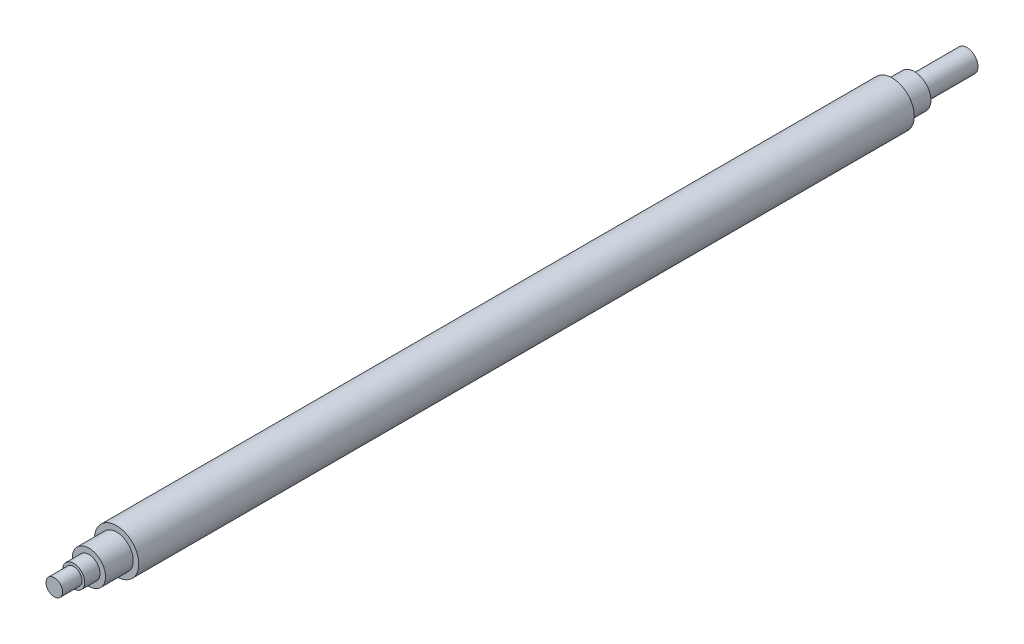
ISO-10303-21;
HEADER;
FILE_DESCRIPTION(('STEP AP214'),'2;1');
FILE_NAME('part.step','',(''),(''),'','','');
FILE_SCHEMA(('AUTOMOTIVE_DESIGN { 1 0 10303 214 1 1 1 1 }'));
ENDSEC;
DATA;
#1=APPLICATION_CONTEXT('core data for automotive mechanical design processes');
#2=APPLICATION_PROTOCOL_DEFINITION('international standard','automotive_design',2000,#1);
#3=PRODUCT_CONTEXT('',#1,'mechanical');
#4=PRODUCT('Part','Part','',(#3));
#5=PRODUCT_RELATED_PRODUCT_CATEGORY('part','',(#4));
#6=PRODUCT_DEFINITION_FORMATION('','',#4);
#7=PRODUCT_DEFINITION_CONTEXT('part definition',#1,'design');
#8=PRODUCT_DEFINITION('design','',#6,#7);
#9=PRODUCT_DEFINITION_SHAPE('','',#8);
#10=(LENGTH_UNIT() NAMED_UNIT(*) SI_UNIT(.MILLI.,.METRE.));
#11=(NAMED_UNIT(*) PLANE_ANGLE_UNIT() SI_UNIT($,.RADIAN.));
#12=(NAMED_UNIT(*) SI_UNIT($,.STERADIAN.) SOLID_ANGLE_UNIT());
#13=UNCERTAINTY_MEASURE_WITH_UNIT(LENGTH_MEASURE(1.E-05),#10,'distance_accuracy_value','');
#14=(GEOMETRIC_REPRESENTATION_CONTEXT(3) GLOBAL_UNCERTAINTY_ASSIGNED_CONTEXT((#13)) GLOBAL_UNIT_ASSIGNED_CONTEXT((#10,
#11,#12)) REPRESENTATION_CONTEXT('',''));
#15=CARTESIAN_POINT('',(0.,0.,0.));
#16=DIRECTION('',(0.,0.,1.));
#17=DIRECTION('',(1.,0.,0.));
#18=AXIS2_PLACEMENT_3D('',#15,#16,#17);
#19=CARTESIAN_POINT('',(0.,0.,-331.));
#20=DIRECTION('',(0.,0.,1.));
#21=DIRECTION('',(1.,0.,0.));
#22=AXIS2_PLACEMENT_3D('',#19,#20,#21);
#23=PLANE('',#22);
#24=CARTESIAN_POINT('',(0.,0.,-331.));
#25=DIRECTION('',(0.,0.,1.));
#26=DIRECTION('',(1.,0.,0.));
#27=AXIS2_PLACEMENT_3D('',#24,#25,#26);
#28=CIRCLE('',#27,4.);
#29=CARTESIAN_POINT('',(4.,0.,-331.));
#30=VERTEX_POINT('',#29);
#31=EDGE_CURVE('E70',#30,#30,#28,.T.);
#32=ORIENTED_EDGE('',*,*,#31,.F.);
#33=EDGE_LOOP('',(#32));
#34=FACE_BOUND('',#33,.T.);
#35=ADVANCED_FACE('F30',(#34),#23,.F.);
#36=CARTESIAN_POINT('',(0.,0.,-1.5));
#37=DIRECTION('',(0.,0.,-1.));
#38=DIRECTION('',(-1.,0.,0.));
#39=AXIS2_PLACEMENT_3D('',#36,#37,#38);
#40=PLANE('',#39);
#41=CARTESIAN_POINT('',(0.,0.,-1.5));
#42=DIRECTION('',(0.,0.,1.));
#43=DIRECTION('',(1.,0.,0.));
#44=AXIS2_PLACEMENT_3D('',#41,#42,#43);
#45=CIRCLE('',#44,3.);
#46=CARTESIAN_POINT('',(3.,0.,-1.5));
#47=VERTEX_POINT('',#46);
#48=EDGE_CURVE('E10',#47,#47,#45,.T.);
#49=ORIENTED_EDGE('',*,*,#48,.T.);
#50=EDGE_LOOP('',(#49));
#51=FACE_BOUND('',#50,.T.);
#52=ADVANCED_FACE('F77',(#51),#40,.F.);
#53=CARTESIAN_POINT('',(0.,0.,0.));
#54=DIRECTION('',(0.,0.,1.));
#55=DIRECTION('',(1.,0.,0.));
#56=AXIS2_PLACEMENT_3D('',#53,#54,#55);
#57=CYLINDRICAL_SURFACE('',#56,3.);
#58=ORIENTED_EDGE('',*,*,#48,.F.);
#59=EDGE_LOOP('',(#58));
#60=FACE_BOUND('',#59,.T.);
#61=CARTESIAN_POINT('',(0.,0.,-8.5));
#62=DIRECTION('',(0.,0.,1.));
#63=DIRECTION('',(1.,0.,0.));
#64=AXIS2_PLACEMENT_3D('',#61,#62,#63);
#65=CIRCLE('',#64,3.);
#66=CARTESIAN_POINT('',(3.,0.,-8.5));
#67=VERTEX_POINT('',#66);
#68=EDGE_CURVE('E36',#67,#67,#65,.T.);
#69=ORIENTED_EDGE('',*,*,#68,.T.);
#70=EDGE_LOOP('',(#69));
#71=FACE_BOUND('',#70,.T.);
#72=ADVANCED_FACE('F81',(#60,#71),#57,.T.);
#73=CARTESIAN_POINT('',(0.,3.,-8.5));
#74=DIRECTION('',(0.,0.,-1.));
#75=DIRECTION('',(-1.,0.,0.));
#76=AXIS2_PLACEMENT_3D('',#73,#74,#75);
#77=PLANE('',#76);
#78=ORIENTED_EDGE('',*,*,#68,.F.);
#79=EDGE_LOOP('',(#78));
#80=FACE_BOUND('',#79,.T.);
#81=CARTESIAN_POINT('',(0.,0.,-8.5));
#82=DIRECTION('',(0.,0.,1.));
#83=DIRECTION('',(1.,0.,0.));
#84=AXIS2_PLACEMENT_3D('',#81,#82,#83);
#85=CIRCLE('',#84,4.);
#86=CARTESIAN_POINT('',(4.,0.,-8.5));
#87=VERTEX_POINT('',#86);
#88=EDGE_CURVE('E40',#87,#87,#85,.T.);
#89=ORIENTED_EDGE('',*,*,#88,.T.);
#90=EDGE_LOOP('',(#89));
#91=FACE_BOUND('',#90,.T.);
#92=ADVANCED_FACE('F85',(#80,#91),#77,.F.);
#93=CARTESIAN_POINT('',(0.,0.,0.));
#94=DIRECTION('',(0.,0.,1.));
#95=DIRECTION('',(1.,0.,0.));
#96=AXIS2_PLACEMENT_3D('',#93,#94,#95);
#97=CYLINDRICAL_SURFACE('',#96,4.);
#98=ORIENTED_EDGE('',*,*,#88,.F.);
#99=EDGE_LOOP('',(#98));
#100=FACE_BOUND('',#99,.T.);
#101=CARTESIAN_POINT('',(0.,0.,-14.));
#102=DIRECTION('',(0.,0.,1.));
#103=DIRECTION('',(1.,0.,0.));
#104=AXIS2_PLACEMENT_3D('',#101,#102,#103);
#105=CIRCLE('',#104,4.);
#106=CARTESIAN_POINT('',(4.,0.,-14.));
#107=VERTEX_POINT('',#106);
#108=EDGE_CURVE('E44',#107,#107,#105,.T.);
#109=ORIENTED_EDGE('',*,*,#108,.T.);
#110=EDGE_LOOP('',(#109));
#111=FACE_BOUND('',#110,.T.);
#112=ADVANCED_FACE('F91',(#100,#111),#97,.T.);
#113=CARTESIAN_POINT('',(0.,4.,-14.));
#114=DIRECTION('',(0.,0.,-1.));
#115=DIRECTION('',(-1.,0.,0.));
#116=AXIS2_PLACEMENT_3D('',#113,#114,#115);
#117=PLANE('',#116);
#118=ORIENTED_EDGE('',*,*,#108,.F.);
#119=EDGE_LOOP('',(#118));
#120=FACE_BOUND('',#119,.T.);
#121=CARTESIAN_POINT('',(0.,0.,-14.));
#122=DIRECTION('',(0.,0.,1.));
#123=DIRECTION('',(1.,0.,0.));
#124=AXIS2_PLACEMENT_3D('',#121,#122,#123);
#125=CIRCLE('',#124,6.);
#126=CARTESIAN_POINT('',(6.,0.,-14.));
#127=VERTEX_POINT('',#126);
#128=EDGE_CURVE('E49',#127,#127,#125,.T.);
#129=ORIENTED_EDGE('',*,*,#128,.T.);
#130=EDGE_LOOP('',(#129));
#131=FACE_BOUND('',#130,.T.);
#132=ADVANCED_FACE('F95',(#120,#131),#117,.F.);
#133=CARTESIAN_POINT('',(0.,0.,0.));
#134=DIRECTION('',(0.,0.,1.));
#135=DIRECTION('',(1.,0.,0.));
#136=AXIS2_PLACEMENT_3D('',#133,#134,#135);
#137=CYLINDRICAL_SURFACE('',#136,6.);
#138=ORIENTED_EDGE('',*,*,#128,.F.);
#139=EDGE_LOOP('',(#138));
#140=FACE_BOUND('',#139,.T.);
#141=CARTESIAN_POINT('',(0.,0.,-24.));
#142=DIRECTION('',(0.,0.,1.));
#143=DIRECTION('',(1.,0.,0.));
#144=AXIS2_PLACEMENT_3D('',#141,#142,#143);
#145=CIRCLE('',#144,6.);
#146=CARTESIAN_POINT('',(6.,0.,-24.));
#147=VERTEX_POINT('',#146);
#148=EDGE_CURVE('E52',#147,#147,#145,.T.);
#149=ORIENTED_EDGE('',*,*,#148,.T.);
#150=EDGE_LOOP('',(#149));
#151=FACE_BOUND('',#150,.T.);
#152=ADVANCED_FACE('F99',(#140,#151),#137,.T.);
#153=CARTESIAN_POINT('',(0.,6.,-24.));
#154=DIRECTION('',(0.,0.,-1.));
#155=DIRECTION('',(-1.,0.,0.));
#156=AXIS2_PLACEMENT_3D('',#153,#154,#155);
#157=PLANE('',#156);
#158=ORIENTED_EDGE('',*,*,#148,.F.);
#159=EDGE_LOOP('',(#158));
#160=FACE_BOUND('',#159,.T.);
#161=CARTESIAN_POINT('',(0.,0.,-24.));
#162=DIRECTION('',(0.,0.,1.));
#163=DIRECTION('',(1.,0.,0.));
#164=AXIS2_PLACEMENT_3D('',#161,#162,#163);
#165=CIRCLE('',#164,8.);
#166=CARTESIAN_POINT('',(8.,0.,-24.));
#167=VERTEX_POINT('',#166);
#168=EDGE_CURVE('E55',#167,#167,#165,.T.);
#169=ORIENTED_EDGE('',*,*,#168,.T.);
#170=EDGE_LOOP('',(#169));
#171=FACE_BOUND('',#170,.T.);
#172=ADVANCED_FACE('F103',(#160,#171),#157,.F.);
#173=CARTESIAN_POINT('',(0.,0.,0.));
#174=DIRECTION('',(0.,0.,1.));
#175=DIRECTION('',(1.,0.,0.));
#176=AXIS2_PLACEMENT_3D('',#173,#174,#175);
#177=CYLINDRICAL_SURFACE('',#176,8.);
#178=ORIENTED_EDGE('',*,*,#168,.F.);
#179=EDGE_LOOP('',(#178));
#180=FACE_BOUND('',#179,.T.);
#181=CARTESIAN_POINT('',(0.,0.,-304.));
#182=DIRECTION('',(0.,0.,1.));
#183=DIRECTION('',(1.,0.,0.));
#184=AXIS2_PLACEMENT_3D('',#181,#182,#183);
#185=CIRCLE('',#184,8.);
#186=CARTESIAN_POINT('',(8.,0.,-304.));
#187=VERTEX_POINT('',#186);
#188=EDGE_CURVE('E58',#187,#187,#185,.T.);
#189=ORIENTED_EDGE('',*,*,#188,.T.);
#190=EDGE_LOOP('',(#189));
#191=FACE_BOUND('',#190,.T.);
#192=ADVANCED_FACE('F107',(#180,#191),#177,.T.);
#193=CARTESIAN_POINT('',(0.,8.,-304.));
#194=DIRECTION('',(0.,0.,1.));
#195=DIRECTION('',(1.,0.,0.));
#196=AXIS2_PLACEMENT_3D('',#193,#194,#195);
#197=PLANE('',#196);
#198=ORIENTED_EDGE('',*,*,#188,.F.);
#199=EDGE_LOOP('',(#198));
#200=FACE_BOUND('',#199,.T.);
#201=CARTESIAN_POINT('',(0.,0.,-304.));
#202=DIRECTION('',(0.,0.,1.));
#203=DIRECTION('',(1.,0.,0.));
#204=AXIS2_PLACEMENT_3D('',#201,#202,#203);
#205=CIRCLE('',#204,6.);
#206=CARTESIAN_POINT('',(6.,0.,-304.));
#207=VERTEX_POINT('',#206);
#208=EDGE_CURVE('E61',#207,#207,#205,.T.);
#209=ORIENTED_EDGE('',*,*,#208,.T.);
#210=EDGE_LOOP('',(#209));
#211=FACE_BOUND('',#210,.T.);
#212=ADVANCED_FACE('F111',(#200,#211),#197,.F.);
#213=CARTESIAN_POINT('',(0.,0.,0.));
#214=DIRECTION('',(0.,0.,1.));
#215=DIRECTION('',(1.,0.,0.));
#216=AXIS2_PLACEMENT_3D('',#213,#214,#215);
#217=CYLINDRICAL_SURFACE('',#216,6.);
#218=ORIENTED_EDGE('',*,*,#208,.F.);
#219=EDGE_LOOP('',(#218));
#220=FACE_BOUND('',#219,.T.);
#221=CARTESIAN_POINT('',(0.,0.,-312.));
#222=DIRECTION('',(0.,0.,1.));
#223=DIRECTION('',(1.,0.,0.));
#224=AXIS2_PLACEMENT_3D('',#221,#222,#223);
#225=CIRCLE('',#224,6.);
#226=CARTESIAN_POINT('',(6.,0.,-312.));
#227=VERTEX_POINT('',#226);
#228=EDGE_CURVE('E64',#227,#227,#225,.T.);
#229=ORIENTED_EDGE('',*,*,#228,.T.);
#230=EDGE_LOOP('',(#229));
#231=FACE_BOUND('',#230,.T.);
#232=ADVANCED_FACE('F115',(#220,#231),#217,.T.);
#233=CARTESIAN_POINT('',(0.,6.,-312.));
#234=DIRECTION('',(0.,0.,1.));
#235=DIRECTION('',(1.,0.,0.));
#236=AXIS2_PLACEMENT_3D('',#233,#234,#235);
#237=PLANE('',#236);
#238=ORIENTED_EDGE('',*,*,#228,.F.);
#239=EDGE_LOOP('',(#238));
#240=FACE_BOUND('',#239,.T.);
#241=CARTESIAN_POINT('',(0.,0.,-312.));
#242=DIRECTION('',(0.,0.,1.));
#243=DIRECTION('',(1.,0.,0.));
#244=AXIS2_PLACEMENT_3D('',#241,#242,#243);
#245=CIRCLE('',#244,4.);
#246=CARTESIAN_POINT('',(4.,0.,-312.));
#247=VERTEX_POINT('',#246);
#248=EDGE_CURVE('E67',#247,#247,#245,.T.);
#249=ORIENTED_EDGE('',*,*,#248,.T.);
#250=EDGE_LOOP('',(#249));
#251=FACE_BOUND('',#250,.T.);
#252=ADVANCED_FACE('F119',(#240,#251),#237,.F.);
#253=CARTESIAN_POINT('',(0.,0.,0.));
#254=DIRECTION('',(0.,0.,1.));
#255=DIRECTION('',(1.,0.,0.));
#256=AXIS2_PLACEMENT_3D('',#253,#254,#255);
#257=CYLINDRICAL_SURFACE('',#256,4.);
#258=ORIENTED_EDGE('',*,*,#248,.F.);
#259=EDGE_LOOP('',(#258));
#260=FACE_BOUND('',#259,.T.);
#261=ORIENTED_EDGE('',*,*,#31,.T.);
#262=EDGE_LOOP('',(#261));
#263=FACE_BOUND('',#262,.T.);
#264=ADVANCED_FACE('F74',(#260,#263),#257,.T.);
#265=CLOSED_SHELL('',(#35,#52,#72,#92,#112,#132,#152,#172,#192,#212,#232,#252,#264));
#266=MANIFOLD_SOLID_BREP('B2',#265);
#267=ADVANCED_BREP_SHAPE_REPRESENTATION('',(#18,#266),#14);
#268=SHAPE_DEFINITION_REPRESENTATION(#9,#267);
ENDSEC;
END-ISO-10303-21;
